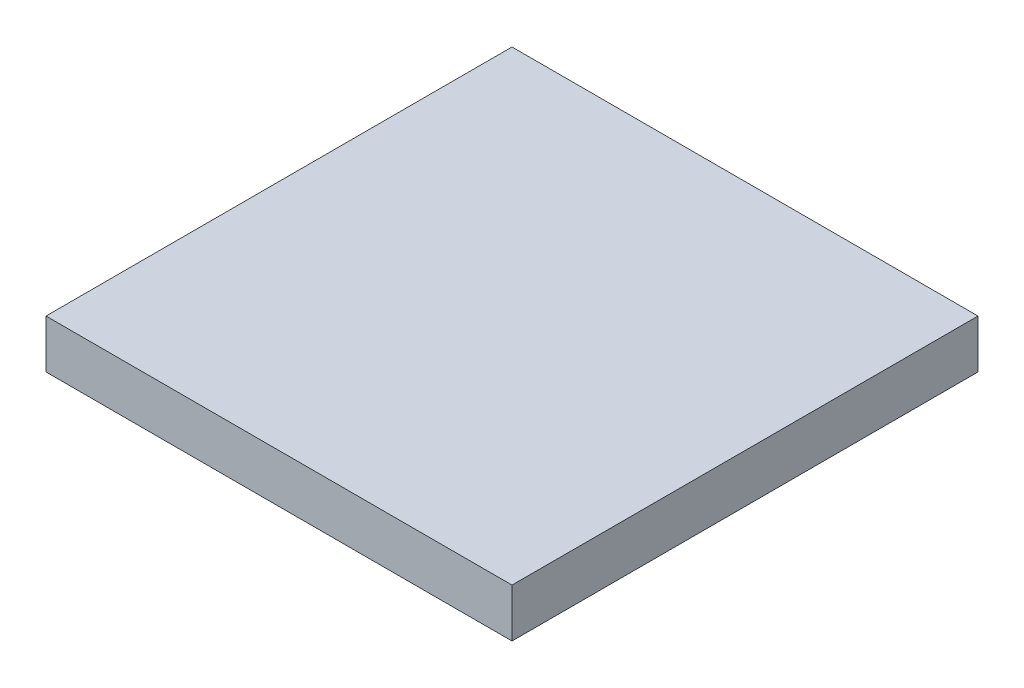
ISO-10303-21;
HEADER;
FILE_DESCRIPTION(('STEP AP214'),'2;1');
FILE_NAME('part.step','',(''),(''),'','','');
FILE_SCHEMA(('AUTOMOTIVE_DESIGN { 1 0 10303 214 1 1 1 1 }'));
ENDSEC;
DATA;
#1=APPLICATION_CONTEXT('core data for automotive mechanical design processes');
#2=APPLICATION_PROTOCOL_DEFINITION('international standard','automotive_design',2000,#1);
#3=PRODUCT_CONTEXT('',#1,'mechanical');
#4=PRODUCT('Part','Part','',(#3));
#5=PRODUCT_RELATED_PRODUCT_CATEGORY('part','',(#4));
#6=PRODUCT_DEFINITION_FORMATION('','',#4);
#7=PRODUCT_DEFINITION_CONTEXT('part definition',#1,'design');
#8=PRODUCT_DEFINITION('design','',#6,#7);
#9=PRODUCT_DEFINITION_SHAPE('','',#8);
#10=(LENGTH_UNIT() NAMED_UNIT(*) SI_UNIT(.MILLI.,.METRE.));
#11=(NAMED_UNIT(*) PLANE_ANGLE_UNIT() SI_UNIT($,.RADIAN.));
#12=(NAMED_UNIT(*) SI_UNIT($,.STERADIAN.) SOLID_ANGLE_UNIT());
#13=UNCERTAINTY_MEASURE_WITH_UNIT(LENGTH_MEASURE(1.E-05),#10,'distance_accuracy_value','');
#14=(GEOMETRIC_REPRESENTATION_CONTEXT(3) GLOBAL_UNCERTAINTY_ASSIGNED_CONTEXT((#13)) GLOBAL_UNIT_ASSIGNED_CONTEXT((#10,
#11,#12)) REPRESENTATION_CONTEXT('',''));
#15=CARTESIAN_POINT('',(0.,0.,0.));
#16=DIRECTION('',(0.,0.,1.));
#17=DIRECTION('',(1.,0.,0.));
#18=AXIS2_PLACEMENT_3D('',#15,#16,#17);
#19=CARTESIAN_POINT('',(0.,3.9624,0.));
#20=DIRECTION('',(1.,0.,0.));
#21=DIRECTION('',(0.,0.,-1.));
#22=AXIS2_PLACEMENT_3D('',#19,#20,#21);
#23=PLANE('',#22);
#24=DIRECTION('',(0.,0.,1.));
#25=VECTOR('',#24,1.);
#26=CARTESIAN_POINT('',(0.,0.,0.));
#27=LINE('',#26,#25);
#28=CARTESIAN_POINT('',(0.,0.,-38.1));
#29=VERTEX_POINT('',#28);
#30=CARTESIAN_POINT('',(0.,0.,0.));
#31=VERTEX_POINT('',#30);
#32=EDGE_CURVE('E107',#29,#31,#27,.T.);
#33=ORIENTED_EDGE('',*,*,#32,.T.);
#34=DIRECTION('',(0.,-1.,0.));
#35=VECTOR('',#34,1.);
#36=CARTESIAN_POINT('',(0.,3.9624,0.));
#37=LINE('',#36,#35);
#38=CARTESIAN_POINT('',(0.,3.9624,0.));
#39=VERTEX_POINT('',#38);
#40=EDGE_CURVE('E11',#39,#31,#37,.T.);
#41=ORIENTED_EDGE('',*,*,#40,.F.);
#42=DIRECTION('',(0.,0.,1.));
#43=VECTOR('',#42,1.);
#44=CARTESIAN_POINT('',(0.,3.9624,0.));
#45=LINE('',#44,#43);
#46=CARTESIAN_POINT('',(0.,3.9624,-38.1));
#47=VERTEX_POINT('',#46);
#48=EDGE_CURVE('E91',#47,#39,#45,.T.);
#49=ORIENTED_EDGE('',*,*,#48,.F.);
#50=DIRECTION('',(0.,-1.,0.));
#51=VECTOR('',#50,1.);
#52=CARTESIAN_POINT('',(0.,3.9624,-38.1));
#53=LINE('',#52,#51);
#54=EDGE_CURVE('E103',#47,#29,#53,.T.);
#55=ORIENTED_EDGE('',*,*,#54,.T.);
#56=EDGE_LOOP('',(#33,#41,#49,#55));
#57=FACE_BOUND('',#56,.T.);
#58=ADVANCED_FACE('F39',(#57),#23,.F.);
#59=CARTESIAN_POINT('',(0.,3.9624,0.));
#60=DIRECTION('',(0.,0.,-1.));
#61=DIRECTION('',(-1.,0.,0.));
#62=AXIS2_PLACEMENT_3D('',#59,#60,#61);
#63=PLANE('',#62);
#64=DIRECTION('',(1.,0.,0.));
#65=VECTOR('',#64,1.);
#66=CARTESIAN_POINT('',(0.,0.,0.));
#67=LINE('',#66,#65);
#68=CARTESIAN_POINT('',(38.1,0.,0.));
#69=VERTEX_POINT('',#68);
#70=EDGE_CURVE('E96',#31,#69,#67,.T.);
#71=ORIENTED_EDGE('',*,*,#70,.T.);
#72=DIRECTION('',(0.,-1.,0.));
#73=VECTOR('',#72,1.);
#74=CARTESIAN_POINT('',(38.1,3.9624,0.));
#75=LINE('',#74,#73);
#76=CARTESIAN_POINT('',(38.1,3.9624,0.));
#77=VERTEX_POINT('',#76);
#78=EDGE_CURVE('E48',#77,#69,#75,.T.);
#79=ORIENTED_EDGE('',*,*,#78,.F.);
#80=DIRECTION('',(1.,0.,0.));
#81=VECTOR('',#80,1.);
#82=CARTESIAN_POINT('',(0.,3.9624,0.));
#83=LINE('',#82,#81);
#84=EDGE_CURVE('E86',#39,#77,#83,.T.);
#85=ORIENTED_EDGE('',*,*,#84,.F.);
#86=ORIENTED_EDGE('',*,*,#40,.T.);
#87=EDGE_LOOP('',(#71,#79,#85,#86));
#88=FACE_BOUND('',#87,.T.);
#89=ADVANCED_FACE('F95',(#88),#63,.F.);
#90=CARTESIAN_POINT('',(38.1,3.9624,0.));
#91=DIRECTION('',(-1.,0.,0.));
#92=DIRECTION('',(0.,0.,1.));
#93=AXIS2_PLACEMENT_3D('',#90,#91,#92);
#94=PLANE('',#93);
#95=DIRECTION('',(0.,0.,-1.));
#96=VECTOR('',#95,1.);
#97=CARTESIAN_POINT('',(38.1,0.,0.));
#98=LINE('',#97,#96);
#99=CARTESIAN_POINT('',(38.1,0.,-38.1));
#100=VERTEX_POINT('',#99);
#101=EDGE_CURVE('E73',#69,#100,#98,.T.);
#102=ORIENTED_EDGE('',*,*,#101,.T.);
#103=DIRECTION('',(0.,-1.,0.));
#104=VECTOR('',#103,1.);
#105=CARTESIAN_POINT('',(38.1,3.9624,-38.1));
#106=LINE('',#105,#104);
#107=CARTESIAN_POINT('',(38.1,3.9624,-38.1));
#108=VERTEX_POINT('',#107);
#109=EDGE_CURVE('E98',#108,#100,#106,.T.);
#110=ORIENTED_EDGE('',*,*,#109,.F.);
#111=DIRECTION('',(0.,0.,-1.));
#112=VECTOR('',#111,1.);
#113=CARTESIAN_POINT('',(38.1,3.9624,0.));
#114=LINE('',#113,#112);
#115=EDGE_CURVE('E89',#77,#108,#114,.T.);
#116=ORIENTED_EDGE('',*,*,#115,.F.);
#117=ORIENTED_EDGE('',*,*,#78,.T.);
#118=EDGE_LOOP('',(#102,#110,#116,#117));
#119=FACE_BOUND('',#118,.T.);
#120=ADVANCED_FACE('F99',(#119),#94,.F.);
#121=CARTESIAN_POINT('',(0.,3.9624,-38.1));
#122=DIRECTION('',(0.,0.,1.));
#123=DIRECTION('',(1.,0.,0.));
#124=AXIS2_PLACEMENT_3D('',#121,#122,#123);
#125=PLANE('',#124);
#126=DIRECTION('',(-1.,0.,0.));
#127=VECTOR('',#126,1.);
#128=CARTESIAN_POINT('',(0.,0.,-38.1));
#129=LINE('',#128,#127);
#130=EDGE_CURVE('E79',#100,#29,#129,.T.);
#131=ORIENTED_EDGE('',*,*,#130,.T.);
#132=ORIENTED_EDGE('',*,*,#54,.F.);
#133=DIRECTION('',(-1.,0.,0.));
#134=VECTOR('',#133,1.);
#135=CARTESIAN_POINT('',(0.,3.9624,-38.1));
#136=LINE('',#135,#134);
#137=EDGE_CURVE('E56',#108,#47,#136,.T.);
#138=ORIENTED_EDGE('',*,*,#137,.F.);
#139=ORIENTED_EDGE('',*,*,#109,.T.);
#140=EDGE_LOOP('',(#131,#132,#138,#139));
#141=FACE_BOUND('',#140,.T.);
#142=ADVANCED_FACE('F120',(#141),#125,.F.);
#143=CARTESIAN_POINT('',(0.,3.9624,0.));
#144=DIRECTION('',(0.,-1.,0.));
#145=DIRECTION('',(0.,0.,-1.));
#146=AXIS2_PLACEMENT_3D('',#143,#144,#145);
#147=PLANE('',#146);
#148=ORIENTED_EDGE('',*,*,#48,.T.);
#149=ORIENTED_EDGE('',*,*,#84,.T.);
#150=ORIENTED_EDGE('',*,*,#115,.T.);
#151=ORIENTED_EDGE('',*,*,#137,.T.);
#152=EDGE_LOOP('',(#148,#149,#150,#151));
#153=FACE_BOUND('',#152,.T.);
#154=ADVANCED_FACE('F87',(#153),#147,.F.);
#155=CARTESIAN_POINT('',(0.,0.,0.));
#156=DIRECTION('',(0.,-1.,0.));
#157=DIRECTION('',(0.,0.,-1.));
#158=AXIS2_PLACEMENT_3D('',#155,#156,#157);
#159=PLANE('',#158);
#160=ORIENTED_EDGE('',*,*,#32,.F.);
#161=ORIENTED_EDGE('',*,*,#130,.F.);
#162=ORIENTED_EDGE('',*,*,#101,.F.);
#163=ORIENTED_EDGE('',*,*,#70,.F.);
#164=EDGE_LOOP('',(#160,#161,#162,#163));
#165=FACE_BOUND('',#164,.T.);
#166=ADVANCED_FACE('F123',(#165),#159,.T.);
#167=CLOSED_SHELL('',(#58,#89,#120,#142,#154,#166));
#168=MANIFOLD_SOLID_BREP('B2',#167);
#169=ADVANCED_BREP_SHAPE_REPRESENTATION('',(#18,#168),#14);
#170=SHAPE_DEFINITION_REPRESENTATION(#9,#169);
ENDSEC;
END-ISO-10303-21;
